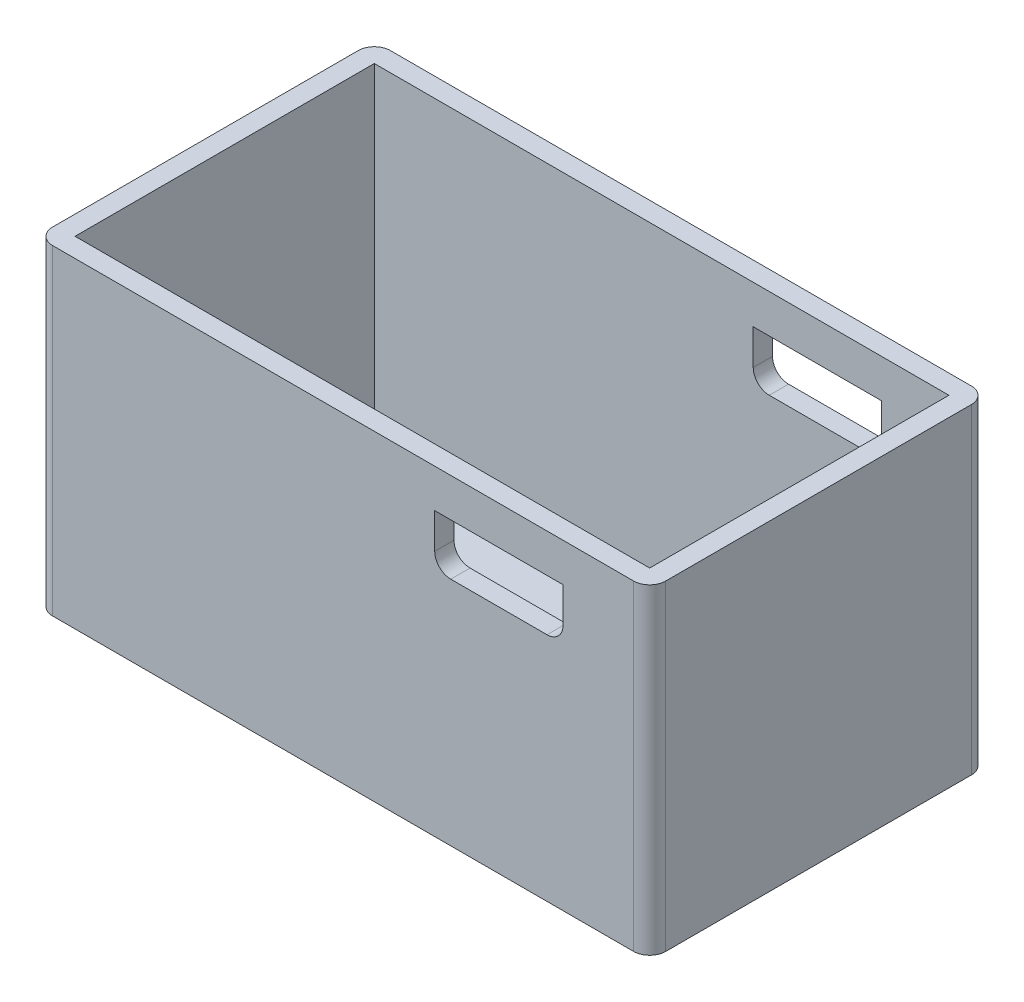
ISO-10303-21;
HEADER;
FILE_DESCRIPTION(('STEP AP214'),'2;1');
FILE_NAME('part.step','',(''),(''),'','','');
FILE_SCHEMA(('AUTOMOTIVE_DESIGN { 1 0 10303 214 1 1 1 1 }'));
ENDSEC;
DATA;
#1=APPLICATION_CONTEXT('core data for automotive mechanical design processes');
#2=APPLICATION_PROTOCOL_DEFINITION('international standard','automotive_design',2000,#1);
#3=PRODUCT_CONTEXT('',#1,'mechanical');
#4=PRODUCT('Part','Part','',(#3));
#5=PRODUCT_RELATED_PRODUCT_CATEGORY('part','',(#4));
#6=PRODUCT_DEFINITION_FORMATION('','',#4);
#7=PRODUCT_DEFINITION_CONTEXT('part definition',#1,'design');
#8=PRODUCT_DEFINITION('design','',#6,#7);
#9=PRODUCT_DEFINITION_SHAPE('','',#8);
#10=(LENGTH_UNIT() NAMED_UNIT(*) SI_UNIT(.MILLI.,.METRE.));
#11=(NAMED_UNIT(*) PLANE_ANGLE_UNIT() SI_UNIT($,.RADIAN.));
#12=(NAMED_UNIT(*) SI_UNIT($,.STERADIAN.) SOLID_ANGLE_UNIT());
#13=UNCERTAINTY_MEASURE_WITH_UNIT(LENGTH_MEASURE(1.E-05),#10,'distance_accuracy_value','');
#14=(GEOMETRIC_REPRESENTATION_CONTEXT(3) GLOBAL_UNCERTAINTY_ASSIGNED_CONTEXT((#13)) GLOBAL_UNIT_ASSIGNED_CONTEXT((#10,
#11,#12)) REPRESENTATION_CONTEXT('',''));
#15=CARTESIAN_POINT('',(0.,0.,0.));
#16=DIRECTION('',(0.,0.,1.));
#17=DIRECTION('',(1.,0.,0.));
#18=AXIS2_PLACEMENT_3D('',#15,#16,#17);
#19=CARTESIAN_POINT('',(12.1350024,12.7,-6.6850006));
#20=DIRECTION('',(-1.,0.,0.));
#21=DIRECTION('',(0.,0.,1.));
#22=AXIS2_PLACEMENT_3D('',#19,#20,#21);
#23=PLANE('',#22);
#24=DIRECTION('',(0.,0.,-1.));
#25=VECTOR('',#24,1.);
#26=CARTESIAN_POINT('',(12.1350024,0.,-6.6850006));
#27=LINE('',#26,#25);
#28=CARTESIAN_POINT('',(12.1350024,0.,6.0500006));
#29=VERTEX_POINT('',#28);
#30=CARTESIAN_POINT('',(12.1350024,0.,-6.0500006));
#31=VERTEX_POINT('',#30);
#32=EDGE_CURVE('E277',#29,#31,#27,.T.);
#33=ORIENTED_EDGE('',*,*,#32,.T.);
#34=DIRECTION('',(0.,-1.,0.));
#35=VECTOR('',#34,1.);
#36=CARTESIAN_POINT('',(12.1350024,12.7,-6.0500006));
#37=LINE('',#36,#35);
#38=CARTESIAN_POINT('',(12.1350024,12.7,-6.0500006));
#39=VERTEX_POINT('',#38);
#40=EDGE_CURVE('E391',#31,#39,#37,.F.);
#41=ORIENTED_EDGE('',*,*,#40,.T.);
#42=DIRECTION('',(0.,0.,-1.));
#43=VECTOR('',#42,1.);
#44=CARTESIAN_POINT('',(12.1350024,12.7,-6.6850006));
#45=LINE('',#44,#43);
#46=CARTESIAN_POINT('',(12.1350024,12.7,6.0500006));
#47=VERTEX_POINT('',#46);
#48=EDGE_CURVE('E311',#47,#39,#45,.T.);
#49=ORIENTED_EDGE('',*,*,#48,.F.);
#50=DIRECTION('',(0.,-1.,0.));
#51=VECTOR('',#50,1.);
#52=CARTESIAN_POINT('',(12.1350024,12.7,6.0500006));
#53=LINE('',#52,#51);
#54=EDGE_CURVE('E387',#47,#29,#53,.T.);
#55=ORIENTED_EDGE('',*,*,#54,.T.);
#56=EDGE_LOOP('',(#33,#41,#49,#55));
#57=FACE_BOUND('',#56,.T.);
#58=ADVANCED_FACE('F39',(#57),#23,.F.);
#59=CARTESIAN_POINT('',(-12.1350024,12.7,-6.6850006));
#60=DIRECTION('',(0.,0.,1.));
#61=DIRECTION('',(1.,0.,0.));
#62=AXIS2_PLACEMENT_3D('',#59,#60,#61);
#63=PLANE('',#62);
#64=DIRECTION('',(0.,-1.,0.));
#65=VECTOR('',#64,1.);
#66=CARTESIAN_POINT('',(3.6260024,11.176,-6.6850006));
#67=LINE('',#66,#65);
#68=CARTESIAN_POINT('',(3.6260024,11.176,-6.6850006));
#69=VERTEX_POINT('',#68);
#70=CARTESIAN_POINT('',(3.6260024,9.779,-6.6850006));
#71=VERTEX_POINT('',#70);
#72=EDGE_CURVE('E232',#69,#71,#67,.T.);
#73=ORIENTED_EDGE('',*,*,#72,.T.);
#74=CARTESIAN_POINT('',(4.2610024,9.779,-6.6850006));
#75=DIRECTION('',(0.,0.,1.));
#76=DIRECTION('',(1.,0.,0.));
#77=AXIS2_PLACEMENT_3D('',#74,#75,#76);
#78=CIRCLE('',#77,0.635);
#79=CARTESIAN_POINT('',(4.2610024,9.144,-6.6850006));
#80=VERTEX_POINT('',#79);
#81=EDGE_CURVE('E437',#71,#80,#78,.T.);
#82=ORIENTED_EDGE('',*,*,#81,.T.);
#83=DIRECTION('',(1.,0.,0.));
#84=VECTOR('',#83,1.);
#85=CARTESIAN_POINT('',(3.6260024,9.144,-6.6850006));
#86=LINE('',#85,#84);
#87=CARTESIAN_POINT('',(8.0710024,9.144,-6.6850006));
#88=VERTEX_POINT('',#87);
#89=EDGE_CURVE('E235',#80,#88,#86,.T.);
#90=ORIENTED_EDGE('',*,*,#89,.T.);
#91=CARTESIAN_POINT('',(8.0710024,9.779,-6.6850006));
#92=DIRECTION('',(0.,0.,1.));
#93=DIRECTION('',(1.,0.,0.));
#94=AXIS2_PLACEMENT_3D('',#91,#92,#93);
#95=CIRCLE('',#94,0.635);
#96=CARTESIAN_POINT('',(8.7060024,9.779,-6.6850006));
#97=VERTEX_POINT('',#96);
#98=EDGE_CURVE('E209',#88,#97,#95,.T.);
#99=ORIENTED_EDGE('',*,*,#98,.T.);
#100=DIRECTION('',(0.,1.,0.));
#101=VECTOR('',#100,1.);
#102=CARTESIAN_POINT('',(8.7060024,11.176,-6.6850006));
#103=LINE('',#102,#101);
#104=CARTESIAN_POINT('',(8.7060024,11.176,-6.6850006));
#105=VERTEX_POINT('',#104);
#106=EDGE_CURVE('E200',#97,#105,#103,.T.);
#107=ORIENTED_EDGE('',*,*,#106,.T.);
#108=DIRECTION('',(-1.,0.,0.));
#109=VECTOR('',#108,1.);
#110=CARTESIAN_POINT('',(3.6260024,11.176,-6.6850006));
#111=LINE('',#110,#109);
#112=EDGE_CURVE('E206',#105,#69,#111,.T.);
#113=ORIENTED_EDGE('',*,*,#112,.T.);
#114=EDGE_LOOP('',(#73,#82,#90,#99,#107,#113));
#115=FACE_BOUND('',#114,.T.);
#116=DIRECTION('',(-1.,0.,0.));
#117=VECTOR('',#116,1.);
#118=CARTESIAN_POINT('',(-12.1350024,0.,-6.6850006));
#119=LINE('',#118,#117);
#120=CARTESIAN_POINT('',(11.5000024,0.,-6.6850006));
#121=VERTEX_POINT('',#120);
#122=CARTESIAN_POINT('',(-11.5000024,0.,-6.6850006));
#123=VERTEX_POINT('',#122);
#124=EDGE_CURVE('E332',#121,#123,#119,.T.);
#125=ORIENTED_EDGE('',*,*,#124,.T.);
#126=DIRECTION('',(0.,-1.,0.));
#127=VECTOR('',#126,1.);
#128=CARTESIAN_POINT('',(-11.5000024,12.7,-6.6850006));
#129=LINE('',#128,#127);
#130=CARTESIAN_POINT('',(-11.5000024,12.7,-6.6850006));
#131=VERTEX_POINT('',#130);
#132=EDGE_CURVE('E365',#123,#131,#129,.F.);
#133=ORIENTED_EDGE('',*,*,#132,.T.);
#134=DIRECTION('',(-1.,0.,0.));
#135=VECTOR('',#134,1.);
#136=CARTESIAN_POINT('',(-12.1350024,12.7,-6.6850006));
#137=LINE('',#136,#135);
#138=CARTESIAN_POINT('',(11.5000024,12.7,-6.6850006));
#139=VERTEX_POINT('',#138);
#140=EDGE_CURVE('E315',#139,#131,#137,.T.);
#141=ORIENTED_EDGE('',*,*,#140,.F.);
#142=DIRECTION('',(0.,-1.,0.));
#143=VECTOR('',#142,1.);
#144=CARTESIAN_POINT('',(11.5000024,12.7,-6.6850006));
#145=LINE('',#144,#143);
#146=EDGE_CURVE('E361',#139,#121,#145,.T.);
#147=ORIENTED_EDGE('',*,*,#146,.T.);
#148=EDGE_LOOP('',(#125,#133,#141,#147));
#149=FACE_BOUND('',#148,.T.);
#150=ADVANCED_FACE('F203',(#115,#149),#63,.F.);
#151=CARTESIAN_POINT('',(-12.1350024,12.7,-6.6850006));
#152=DIRECTION('',(1.,0.,0.));
#153=DIRECTION('',(0.,0.,-1.));
#154=AXIS2_PLACEMENT_3D('',#151,#152,#153);
#155=PLANE('',#154);
#156=DIRECTION('',(0.,0.,1.));
#157=VECTOR('',#156,1.);
#158=CARTESIAN_POINT('',(-12.1350024,12.7,-6.6850006));
#159=LINE('',#158,#157);
#160=CARTESIAN_POINT('',(-12.1350024,12.7,-6.0500006));
#161=VERTEX_POINT('',#160);
#162=CARTESIAN_POINT('',(-12.1350024,12.7,6.0500006));
#163=VERTEX_POINT('',#162);
#164=EDGE_CURVE('E320',#161,#163,#159,.T.);
#165=ORIENTED_EDGE('',*,*,#164,.F.);
#166=DIRECTION('',(0.,-1.,0.));
#167=VECTOR('',#166,1.);
#168=CARTESIAN_POINT('',(-12.1350024,12.7,-6.0500006));
#169=LINE('',#168,#167);
#170=CARTESIAN_POINT('',(-12.1350024,0.,-6.0500006));
#171=VERTEX_POINT('',#170);
#172=EDGE_CURVE('E345',#161,#171,#169,.T.);
#173=ORIENTED_EDGE('',*,*,#172,.T.);
#174=DIRECTION('',(0.,0.,1.));
#175=VECTOR('',#174,1.);
#176=CARTESIAN_POINT('',(-12.1350024,0.,-6.6850006));
#177=LINE('',#176,#175);
#178=CARTESIAN_POINT('',(-12.1350024,0.,6.0500006));
#179=VERTEX_POINT('',#178);
#180=EDGE_CURVE('E336',#171,#179,#177,.T.);
#181=ORIENTED_EDGE('',*,*,#180,.T.);
#182=DIRECTION('',(0.,-1.,0.));
#183=VECTOR('',#182,1.);
#184=CARTESIAN_POINT('',(-12.1350024,12.7,6.0500006));
#185=LINE('',#184,#183);
#186=EDGE_CURVE('E328',#179,#163,#185,.F.);
#187=ORIENTED_EDGE('',*,*,#186,.T.);
#188=EDGE_LOOP('',(#165,#173,#181,#187));
#189=FACE_BOUND('',#188,.T.);
#190=ADVANCED_FACE('F497',(#189),#155,.F.);
#191=CARTESIAN_POINT('',(-12.1350024,12.7,6.6850006));
#192=DIRECTION('',(0.,0.,-1.));
#193=DIRECTION('',(-1.,0.,0.));
#194=AXIS2_PLACEMENT_3D('',#191,#192,#193);
#195=PLANE('',#194);
#196=DIRECTION('',(-1.,0.,0.));
#197=VECTOR('',#196,1.);
#198=CARTESIAN_POINT('',(3.6260024,11.176,6.6850006));
#199=LINE('',#198,#197);
#200=CARTESIAN_POINT('',(8.7060024,11.176,6.6850006));
#201=VERTEX_POINT('',#200);
#202=CARTESIAN_POINT('',(3.6260024,11.176,6.6850006));
#203=VERTEX_POINT('',#202);
#204=EDGE_CURVE('E243',#201,#203,#199,.T.);
#205=ORIENTED_EDGE('',*,*,#204,.F.);
#206=DIRECTION('',(0.,1.,0.));
#207=VECTOR('',#206,1.);
#208=CARTESIAN_POINT('',(8.7060024,11.176,6.6850006));
#209=LINE('',#208,#207);
#210=CARTESIAN_POINT('',(8.7060024,9.779,6.6850006));
#211=VERTEX_POINT('',#210);
#212=EDGE_CURVE('E240',#211,#201,#209,.T.);
#213=ORIENTED_EDGE('',*,*,#212,.F.);
#214=CARTESIAN_POINT('',(8.0710024,9.779,6.6850006));
#215=DIRECTION('',(0.,0.,-1.));
#216=DIRECTION('',(-1.,0.,0.));
#217=AXIS2_PLACEMENT_3D('',#214,#215,#216);
#218=CIRCLE('',#217,0.635);
#219=CARTESIAN_POINT('',(8.0710024,9.144,6.6850006));
#220=VERTEX_POINT('',#219);
#221=EDGE_CURVE('E445',#211,#220,#218,.T.);
#222=ORIENTED_EDGE('',*,*,#221,.T.);
#223=DIRECTION('',(1.,0.,0.));
#224=VECTOR('',#223,1.);
#225=CARTESIAN_POINT('',(3.6260024,9.144,6.6850006));
#226=LINE('',#225,#224);
#227=CARTESIAN_POINT('',(4.2610024,9.144,6.6850006));
#228=VERTEX_POINT('',#227);
#229=EDGE_CURVE('E214',#228,#220,#226,.T.);
#230=ORIENTED_EDGE('',*,*,#229,.F.);
#231=CARTESIAN_POINT('',(4.2610024,9.779,6.6850006));
#232=DIRECTION('',(0.,0.,-1.));
#233=DIRECTION('',(-1.,0.,0.));
#234=AXIS2_PLACEMENT_3D('',#231,#232,#233);
#235=CIRCLE('',#234,0.635);
#236=CARTESIAN_POINT('',(3.6260024,9.779,6.6850006));
#237=VERTEX_POINT('',#236);
#238=EDGE_CURVE('E48',#228,#237,#235,.T.);
#239=ORIENTED_EDGE('',*,*,#238,.T.);
#240=DIRECTION('',(0.,-1.,0.));
#241=VECTOR('',#240,1.);
#242=CARTESIAN_POINT('',(3.6260024,11.176,6.6850006));
#243=LINE('',#242,#241);
#244=EDGE_CURVE('E247',#203,#237,#243,.T.);
#245=ORIENTED_EDGE('',*,*,#244,.F.);
#246=EDGE_LOOP('',(#205,#213,#222,#230,#239,#245));
#247=FACE_BOUND('',#246,.T.);
#248=DIRECTION('',(1.,0.,0.));
#249=VECTOR('',#248,1.);
#250=CARTESIAN_POINT('',(-12.1350024,12.7,6.6850006));
#251=LINE('',#250,#249);
#252=CARTESIAN_POINT('',(-11.5000024,12.7,6.6850006));
#253=VERTEX_POINT('',#252);
#254=CARTESIAN_POINT('',(11.5000024,12.7,6.6850006));
#255=VERTEX_POINT('',#254);
#256=EDGE_CURVE('E324',#253,#255,#251,.T.);
#257=ORIENTED_EDGE('',*,*,#256,.F.);
#258=DIRECTION('',(0.,-1.,0.));
#259=VECTOR('',#258,1.);
#260=CARTESIAN_POINT('',(-11.5000024,12.7,6.6850006));
#261=LINE('',#260,#259);
#262=CARTESIAN_POINT('',(-11.5000024,0.,6.6850006));
#263=VERTEX_POINT('',#262);
#264=EDGE_CURVE('E383',#253,#263,#261,.T.);
#265=ORIENTED_EDGE('',*,*,#264,.T.);
#266=DIRECTION('',(1.,0.,0.));
#267=VECTOR('',#266,1.);
#268=CARTESIAN_POINT('',(-12.1350024,0.,6.6850006));
#269=LINE('',#268,#267);
#270=CARTESIAN_POINT('',(11.5000024,0.,6.6850006));
#271=VERTEX_POINT('',#270);
#272=EDGE_CURVE('E316',#263,#271,#269,.T.);
#273=ORIENTED_EDGE('',*,*,#272,.T.);
#274=DIRECTION('',(0.,-1.,0.));
#275=VECTOR('',#274,1.);
#276=CARTESIAN_POINT('',(11.5000024,12.7,6.6850006));
#277=LINE('',#276,#275);
#278=EDGE_CURVE('E380',#271,#255,#277,.F.);
#279=ORIENTED_EDGE('',*,*,#278,.T.);
#280=EDGE_LOOP('',(#257,#265,#273,#279));
#281=FACE_BOUND('',#280,.T.);
#282=ADVANCED_FACE('F463',(#247,#281),#195,.F.);
#283=CARTESIAN_POINT('',(0.,12.7,0.));
#284=DIRECTION('',(0.,1.,0.));
#285=DIRECTION('',(0.,0.,1.));
#286=AXIS2_PLACEMENT_3D('',#283,#284,#285);
#287=PLANE('',#286);
#288=DIRECTION('',(0.,0.,-1.));
#289=VECTOR('',#288,1.);
#290=CARTESIAN_POINT('',(11.3730024,12.7,-6.6850006));
#291=LINE('',#290,#289);
#292=CARTESIAN_POINT('',(11.3730024,12.7,5.9230006));
#293=VERTEX_POINT('',#292);
#294=CARTESIAN_POINT('',(11.3730024,12.7,-5.9230006));
#295=VERTEX_POINT('',#294);
#296=EDGE_CURVE('E299',#293,#295,#291,.T.);
#297=ORIENTED_EDGE('',*,*,#296,.F.);
#298=DIRECTION('',(1.,0.,0.));
#299=VECTOR('',#298,1.);
#300=CARTESIAN_POINT('',(-12.1350024,12.7,5.9230006));
#301=LINE('',#300,#299);
#302=CARTESIAN_POINT('',(-11.3730024,12.7,5.9230006));
#303=VERTEX_POINT('',#302);
#304=EDGE_CURVE('E284',#303,#293,#301,.T.);
#305=ORIENTED_EDGE('',*,*,#304,.F.);
#306=DIRECTION('',(0.,0.,1.));
#307=VECTOR('',#306,1.);
#308=CARTESIAN_POINT('',(-11.3730024,12.7,-6.6850006));
#309=LINE('',#308,#307);
#310=CARTESIAN_POINT('',(-11.3730024,12.7,-5.9230006));
#311=VERTEX_POINT('',#310);
#312=EDGE_CURVE('E305',#311,#303,#309,.T.);
#313=ORIENTED_EDGE('',*,*,#312,.F.);
#314=DIRECTION('',(-1.,0.,0.));
#315=VECTOR('',#314,1.);
#316=CARTESIAN_POINT('',(-12.1350024,12.7,-5.9230006));
#317=LINE('',#316,#315);
#318=EDGE_CURVE('E302',#295,#311,#317,.T.);
#319=ORIENTED_EDGE('',*,*,#318,.F.);
#320=EDGE_LOOP('',(#297,#305,#313,#319));
#321=FACE_BOUND('',#320,.T.);
#322=ORIENTED_EDGE('',*,*,#140,.T.);
#323=CARTESIAN_POINT('',(-11.5000024,12.7,-6.0500006));
#324=DIRECTION('',(0.,1.,0.));
#325=DIRECTION('',(0.,0.,1.));
#326=AXIS2_PLACEMENT_3D('',#323,#324,#325);
#327=CIRCLE('',#326,0.635);
#328=EDGE_CURVE('E377',#131,#161,#327,.T.);
#329=ORIENTED_EDGE('',*,*,#328,.T.);
#330=ORIENTED_EDGE('',*,*,#164,.T.);
#331=CARTESIAN_POINT('',(-11.5000024,12.7,6.0500006));
#332=DIRECTION('',(0.,1.,0.));
#333=DIRECTION('',(0.,0.,1.));
#334=AXIS2_PLACEMENT_3D('',#331,#332,#333);
#335=CIRCLE('',#334,0.635);
#336=EDGE_CURVE('E374',#163,#253,#335,.T.);
#337=ORIENTED_EDGE('',*,*,#336,.T.);
#338=ORIENTED_EDGE('',*,*,#256,.T.);
#339=CARTESIAN_POINT('',(11.5000024,12.7,6.0500006));
#340=DIRECTION('',(0.,1.,0.));
#341=DIRECTION('',(0.,0.,1.));
#342=AXIS2_PLACEMENT_3D('',#339,#340,#341);
#343=CIRCLE('',#342,0.635);
#344=EDGE_CURVE('E368',#255,#47,#343,.T.);
#345=ORIENTED_EDGE('',*,*,#344,.T.);
#346=ORIENTED_EDGE('',*,*,#48,.T.);
#347=CARTESIAN_POINT('',(11.5000024,12.7,-6.0500006));
#348=DIRECTION('',(0.,1.,0.));
#349=DIRECTION('',(0.,0.,1.));
#350=AXIS2_PLACEMENT_3D('',#347,#348,#349);
#351=CIRCLE('',#350,0.635);
#352=EDGE_CURVE('E371',#39,#139,#351,.T.);
#353=ORIENTED_EDGE('',*,*,#352,.T.);
#354=EDGE_LOOP('',(#322,#329,#330,#337,#338,#345,#346,#353));
#355=FACE_BOUND('',#354,.T.);
#356=ADVANCED_FACE('F627',(#321,#355),#287,.T.);
#357=CARTESIAN_POINT('',(0.,0.,0.));
#358=DIRECTION('',(0.,1.,0.));
#359=DIRECTION('',(0.,0.,1.));
#360=AXIS2_PLACEMENT_3D('',#357,#358,#359);
#361=PLANE('',#360);
#362=ORIENTED_EDGE('',*,*,#180,.F.);
#363=CARTESIAN_POINT('',(-11.5000024,0.,-6.0500006));
#364=DIRECTION('',(0.,1.,0.));
#365=DIRECTION('',(0.,0.,1.));
#366=AXIS2_PLACEMENT_3D('',#363,#364,#365);
#367=CIRCLE('',#366,0.635);
#368=EDGE_CURVE('E358',#171,#123,#367,.F.);
#369=ORIENTED_EDGE('',*,*,#368,.T.);
#370=ORIENTED_EDGE('',*,*,#124,.F.);
#371=CARTESIAN_POINT('',(11.5000024,0.,-6.0500006));
#372=DIRECTION('',(0.,1.,0.));
#373=DIRECTION('',(0.,0.,1.));
#374=AXIS2_PLACEMENT_3D('',#371,#372,#373);
#375=CIRCLE('',#374,0.635);
#376=EDGE_CURVE('E352',#121,#31,#375,.F.);
#377=ORIENTED_EDGE('',*,*,#376,.T.);
#378=ORIENTED_EDGE('',*,*,#32,.F.);
#379=CARTESIAN_POINT('',(11.5000024,0.,6.0500006));
#380=DIRECTION('',(0.,1.,0.));
#381=DIRECTION('',(0.,0.,1.));
#382=AXIS2_PLACEMENT_3D('',#379,#380,#381);
#383=CIRCLE('',#382,0.635);
#384=EDGE_CURVE('E349',#29,#271,#383,.F.);
#385=ORIENTED_EDGE('',*,*,#384,.T.);
#386=ORIENTED_EDGE('',*,*,#272,.F.);
#387=CARTESIAN_POINT('',(-11.5000024,0.,6.0500006));
#388=DIRECTION('',(0.,1.,0.));
#389=DIRECTION('',(0.,0.,1.));
#390=AXIS2_PLACEMENT_3D('',#387,#388,#389);
#391=CIRCLE('',#390,0.635);
#392=EDGE_CURVE('E355',#263,#179,#391,.F.);
#393=ORIENTED_EDGE('',*,*,#392,.T.);
#394=EDGE_LOOP('',(#362,#369,#370,#377,#378,#385,#386,#393));
#395=FACE_BOUND('',#394,.T.);
#396=ADVANCED_FACE('F677',(#395),#361,.F.);
#397=CARTESIAN_POINT('',(11.3730024,12.7,-6.6850006));
#398=DIRECTION('',(-1.,0.,0.));
#399=DIRECTION('',(0.,0.,1.));
#400=AXIS2_PLACEMENT_3D('',#397,#398,#399);
#401=PLANE('',#400);
#402=DIRECTION('',(0.,0.,-1.));
#403=VECTOR('',#402,1.);
#404=CARTESIAN_POINT('',(11.3730024,0.762000000000001,-6.6850006));
#405=LINE('',#404,#403);
#406=CARTESIAN_POINT('',(11.3730024,0.762,5.9230006));
#407=VERTEX_POINT('',#406);
#408=CARTESIAN_POINT('',(11.3730024,0.762,-5.9230006));
#409=VERTEX_POINT('',#408);
#410=EDGE_CURVE('E268',#407,#409,#405,.T.);
#411=ORIENTED_EDGE('',*,*,#410,.F.);
#412=DIRECTION('',(0.,-1.,0.));
#413=VECTOR('',#412,1.);
#414=CARTESIAN_POINT('',(11.3730024,12.7,5.9230006));
#415=LINE('',#414,#413);
#416=EDGE_CURVE('E279',#293,#407,#415,.T.);
#417=ORIENTED_EDGE('',*,*,#416,.F.);
#418=ORIENTED_EDGE('',*,*,#296,.T.);
#419=DIRECTION('',(0.,-1.,0.));
#420=VECTOR('',#419,1.);
#421=CARTESIAN_POINT('',(11.3730024,12.7,-5.9230006));
#422=LINE('',#421,#420);
#423=EDGE_CURVE('E273',#295,#409,#422,.T.);
#424=ORIENTED_EDGE('',*,*,#423,.T.);
#425=EDGE_LOOP('',(#411,#417,#418,#424));
#426=FACE_BOUND('',#425,.T.);
#427=ADVANCED_FACE('F615',(#426),#401,.T.);
#428=CARTESIAN_POINT('',(-12.1350024,12.7,-5.9230006));
#429=DIRECTION('',(0.,0.,1.));
#430=DIRECTION('',(1.,0.,0.));
#431=AXIS2_PLACEMENT_3D('',#428,#429,#430);
#432=PLANE('',#431);
#433=DIRECTION('',(0.,1.,0.));
#434=VECTOR('',#433,1.);
#435=CARTESIAN_POINT('',(8.7060024,12.7,-5.9230006));
#436=LINE('',#435,#434);
#437=CARTESIAN_POINT('',(8.7060024,9.779,-5.9230006));
#438=VERTEX_POINT('',#437);
#439=CARTESIAN_POINT('',(8.7060024,11.176,-5.9230006));
#440=VERTEX_POINT('',#439);
#441=EDGE_CURVE('E220',#438,#440,#436,.T.);
#442=ORIENTED_EDGE('',*,*,#441,.F.);
#443=CARTESIAN_POINT('',(8.0710024,9.779,-5.9230006));
#444=DIRECTION('',(0.,0.,1.));
#445=DIRECTION('',(1.,0.,0.));
#446=AXIS2_PLACEMENT_3D('',#443,#444,#445);
#447=CIRCLE('',#446,0.635);
#448=CARTESIAN_POINT('',(8.0710024,9.144,-5.9230006));
#449=VERTEX_POINT('',#448);
#450=EDGE_CURVE('E440',#438,#449,#447,.F.);
#451=ORIENTED_EDGE('',*,*,#450,.T.);
#452=DIRECTION('',(1.,0.,0.));
#453=VECTOR('',#452,1.);
#454=CARTESIAN_POINT('',(-12.1350024,9.14399999999999,-5.9230006));
#455=LINE('',#454,#453);
#456=CARTESIAN_POINT('',(4.2610024,9.144,-5.9230006));
#457=VERTEX_POINT('',#456);
#458=EDGE_CURVE('E262',#457,#449,#455,.T.);
#459=ORIENTED_EDGE('',*,*,#458,.F.);
#460=CARTESIAN_POINT('',(4.2610024,9.779,-5.9230006));
#461=DIRECTION('',(0.,0.,1.));
#462=DIRECTION('',(1.,0.,0.));
#463=AXIS2_PLACEMENT_3D('',#460,#461,#462);
#464=CIRCLE('',#463,0.635);
#465=CARTESIAN_POINT('',(3.6260024,9.779,-5.9230006));
#466=VERTEX_POINT('',#465);
#467=EDGE_CURVE('E434',#457,#466,#464,.F.);
#468=ORIENTED_EDGE('',*,*,#467,.T.);
#469=DIRECTION('',(0.,-1.,0.));
#470=VECTOR('',#469,1.);
#471=CARTESIAN_POINT('',(3.6260024,12.7,-5.9230006));
#472=LINE('',#471,#470);
#473=CARTESIAN_POINT('',(3.6260024,11.176,-5.9230006));
#474=VERTEX_POINT('',#473);
#475=EDGE_CURVE('E258',#474,#466,#472,.T.);
#476=ORIENTED_EDGE('',*,*,#475,.F.);
#477=DIRECTION('',(-1.,0.,0.));
#478=VECTOR('',#477,1.);
#479=CARTESIAN_POINT('',(-12.1350024,11.176,-5.9230006));
#480=LINE('',#479,#478);
#481=EDGE_CURVE('E254',#440,#474,#480,.T.);
#482=ORIENTED_EDGE('',*,*,#481,.F.);
#483=EDGE_LOOP('',(#442,#451,#459,#468,#476,#482));
#484=FACE_BOUND('',#483,.T.);
#485=DIRECTION('',(-1.,0.,0.));
#486=VECTOR('',#485,1.);
#487=CARTESIAN_POINT('',(-12.1350024,0.762000000000001,-5.9230006));
#488=LINE('',#487,#486);
#489=CARTESIAN_POINT('',(-11.3730024,0.762,-5.9230006));
#490=VERTEX_POINT('',#489);
#491=EDGE_CURVE('E272',#409,#490,#488,.T.);
#492=ORIENTED_EDGE('',*,*,#491,.F.);
#493=ORIENTED_EDGE('',*,*,#423,.F.);
#494=ORIENTED_EDGE('',*,*,#318,.T.);
#495=DIRECTION('',(0.,-1.,0.));
#496=VECTOR('',#495,1.);
#497=CARTESIAN_POINT('',(-11.3730024,12.7,-5.9230006));
#498=LINE('',#497,#496);
#499=EDGE_CURVE('E278',#311,#490,#498,.T.);
#500=ORIENTED_EDGE('',*,*,#499,.T.);
#501=EDGE_LOOP('',(#492,#493,#494,#500));
#502=FACE_BOUND('',#501,.T.);
#503=ADVANCED_FACE('F610',(#484,#502),#432,.T.);
#504=CARTESIAN_POINT('',(-11.3730024,12.7,-6.6850006));
#505=DIRECTION('',(1.,0.,0.));
#506=DIRECTION('',(0.,0.,-1.));
#507=AXIS2_PLACEMENT_3D('',#504,#505,#506);
#508=PLANE('',#507);
#509=DIRECTION('',(0.,0.,1.));
#510=VECTOR('',#509,1.);
#511=CARTESIAN_POINT('',(-11.3730024,0.762000000000001,-6.6850006));
#512=LINE('',#511,#510);
#513=CARTESIAN_POINT('',(-11.3730024,0.762,5.9230006));
#514=VERTEX_POINT('',#513);
#515=EDGE_CURVE('E287',#490,#514,#512,.T.);
#516=ORIENTED_EDGE('',*,*,#515,.F.);
#517=ORIENTED_EDGE('',*,*,#499,.F.);
#518=ORIENTED_EDGE('',*,*,#312,.T.);
#519=DIRECTION('',(0.,-1.,0.));
#520=VECTOR('',#519,1.);
#521=CARTESIAN_POINT('',(-11.3730024,12.7,5.9230006));
#522=LINE('',#521,#520);
#523=EDGE_CURVE('E283',#303,#514,#522,.T.);
#524=ORIENTED_EDGE('',*,*,#523,.T.);
#525=EDGE_LOOP('',(#516,#517,#518,#524));
#526=FACE_BOUND('',#525,.T.);
#527=ADVANCED_FACE('F601',(#526),#508,.T.);
#528=CARTESIAN_POINT('',(-12.1350024,12.7,5.9230006));
#529=DIRECTION('',(0.,0.,-1.));
#530=DIRECTION('',(-1.,0.,0.));
#531=AXIS2_PLACEMENT_3D('',#528,#529,#530);
#532=PLANE('',#531);
#533=DIRECTION('',(0.,-1.,0.));
#534=VECTOR('',#533,1.);
#535=CARTESIAN_POINT('',(8.7060024,12.7,5.9230006));
#536=LINE('',#535,#534);
#537=CARTESIAN_POINT('',(8.7060024,11.176,5.9230006));
#538=VERTEX_POINT('',#537);
#539=CARTESIAN_POINT('',(8.7060024,9.779,5.9230006));
#540=VERTEX_POINT('',#539);
#541=EDGE_CURVE('E404',#538,#540,#536,.T.);
#542=ORIENTED_EDGE('',*,*,#541,.F.);
#543=DIRECTION('',(1.,0.,0.));
#544=VECTOR('',#543,1.);
#545=CARTESIAN_POINT('',(-12.1350024,11.176,5.9230006));
#546=LINE('',#545,#544);
#547=CARTESIAN_POINT('',(3.6260024,11.176,5.9230006));
#548=VERTEX_POINT('',#547);
#549=EDGE_CURVE('E394',#548,#538,#546,.T.);
#550=ORIENTED_EDGE('',*,*,#549,.F.);
#551=DIRECTION('',(0.,1.,0.));
#552=VECTOR('',#551,1.);
#553=CARTESIAN_POINT('',(3.6260024,12.7,5.9230006));
#554=LINE('',#553,#552);
#555=CARTESIAN_POINT('',(3.6260024,9.779,5.9230006));
#556=VERTEX_POINT('',#555);
#557=EDGE_CURVE('E397',#556,#548,#554,.T.);
#558=ORIENTED_EDGE('',*,*,#557,.F.);
#559=CARTESIAN_POINT('',(4.2610024,9.779,5.9230006));
#560=DIRECTION('',(0.,0.,-1.));
#561=DIRECTION('',(-1.,0.,0.));
#562=AXIS2_PLACEMENT_3D('',#559,#560,#561);
#563=CIRCLE('',#562,0.635);
#564=CARTESIAN_POINT('',(4.2610024,9.144,5.9230006));
#565=VERTEX_POINT('',#564);
#566=EDGE_CURVE('E11',#556,#565,#563,.F.);
#567=ORIENTED_EDGE('',*,*,#566,.T.);
#568=DIRECTION('',(-1.,0.,0.));
#569=VECTOR('',#568,1.);
#570=CARTESIAN_POINT('',(-12.1350024,9.14399999999999,5.9230006));
#571=LINE('',#570,#569);
#572=CARTESIAN_POINT('',(8.0710024,9.144,5.9230006));
#573=VERTEX_POINT('',#572);
#574=EDGE_CURVE('E400',#573,#565,#571,.T.);
#575=ORIENTED_EDGE('',*,*,#574,.F.);
#576=CARTESIAN_POINT('',(8.0710024,9.779,5.9230006));
#577=DIRECTION('',(0.,0.,-1.));
#578=DIRECTION('',(-1.,0.,0.));
#579=AXIS2_PLACEMENT_3D('',#576,#577,#578);
#580=CIRCLE('',#579,0.635);
#581=EDGE_CURVE('E448',#573,#540,#580,.F.);
#582=ORIENTED_EDGE('',*,*,#581,.T.);
#583=EDGE_LOOP('',(#542,#550,#558,#567,#575,#582));
#584=FACE_BOUND('',#583,.T.);
#585=DIRECTION('',(1.,0.,0.));
#586=VECTOR('',#585,1.);
#587=CARTESIAN_POINT('',(-12.1350024,0.762000000000001,5.9230006));
#588=LINE('',#587,#586);
#589=EDGE_CURVE('E293',#514,#407,#588,.T.);
#590=ORIENTED_EDGE('',*,*,#589,.F.);
#591=ORIENTED_EDGE('',*,*,#523,.F.);
#592=ORIENTED_EDGE('',*,*,#304,.T.);
#593=ORIENTED_EDGE('',*,*,#416,.T.);
#594=EDGE_LOOP('',(#590,#591,#592,#593));
#595=FACE_BOUND('',#594,.T.);
#596=ADVANCED_FACE('F471',(#584,#595),#532,.T.);
#597=CARTESIAN_POINT('',(0.,0.762,0.));
#598=DIRECTION('',(0.,1.,0.));
#599=DIRECTION('',(0.,0.,1.));
#600=AXIS2_PLACEMENT_3D('',#597,#598,#599);
#601=PLANE('',#600);
#602=ORIENTED_EDGE('',*,*,#410,.T.);
#603=ORIENTED_EDGE('',*,*,#491,.T.);
#604=ORIENTED_EDGE('',*,*,#515,.T.);
#605=ORIENTED_EDGE('',*,*,#589,.T.);
#606=EDGE_LOOP('',(#602,#603,#604,#605));
#607=FACE_BOUND('',#606,.T.);
#608=ADVANCED_FACE('F505',(#607),#601,.T.);
#609=CARTESIAN_POINT('',(-11.5000024,12.7,-6.0500006));
#610=DIRECTION('',(0.,-1.,0.));
#611=DIRECTION('',(0.,0.,-1.));
#612=AXIS2_PLACEMENT_3D('',#609,#610,#611);
#613=CYLINDRICAL_SURFACE('',#612,0.635);
#614=ORIENTED_EDGE('',*,*,#328,.F.);
#615=ORIENTED_EDGE('',*,*,#132,.F.);
#616=ORIENTED_EDGE('',*,*,#368,.F.);
#617=ORIENTED_EDGE('',*,*,#172,.F.);
#618=EDGE_LOOP('',(#614,#615,#616,#617));
#619=FACE_BOUND('',#618,.T.);
#620=ADVANCED_FACE('F501',(#619),#613,.T.);
#621=CARTESIAN_POINT('',(-11.5000024,12.7,6.0500006));
#622=DIRECTION('',(0.,-1.,0.));
#623=DIRECTION('',(0.,0.,-1.));
#624=AXIS2_PLACEMENT_3D('',#621,#622,#623);
#625=CYLINDRICAL_SURFACE('',#624,0.635);
#626=ORIENTED_EDGE('',*,*,#336,.F.);
#627=ORIENTED_EDGE('',*,*,#186,.F.);
#628=ORIENTED_EDGE('',*,*,#392,.F.);
#629=ORIENTED_EDGE('',*,*,#264,.F.);
#630=EDGE_LOOP('',(#626,#627,#628,#629));
#631=FACE_BOUND('',#630,.T.);
#632=ADVANCED_FACE('F504',(#631),#625,.T.);
#633=CARTESIAN_POINT('',(11.5000024,12.7,-6.0500006));
#634=DIRECTION('',(0.,-1.,0.));
#635=DIRECTION('',(0.,0.,-1.));
#636=AXIS2_PLACEMENT_3D('',#633,#634,#635);
#637=CYLINDRICAL_SURFACE('',#636,0.635);
#638=ORIENTED_EDGE('',*,*,#352,.F.);
#639=ORIENTED_EDGE('',*,*,#40,.F.);
#640=ORIENTED_EDGE('',*,*,#376,.F.);
#641=ORIENTED_EDGE('',*,*,#146,.F.);
#642=EDGE_LOOP('',(#638,#639,#640,#641));
#643=FACE_BOUND('',#642,.T.);
#644=ADVANCED_FACE('F509',(#643),#637,.T.);
#645=CARTESIAN_POINT('',(11.5000024,12.7,6.0500006));
#646=DIRECTION('',(0.,-1.,0.));
#647=DIRECTION('',(0.,0.,-1.));
#648=AXIS2_PLACEMENT_3D('',#645,#646,#647);
#649=CYLINDRICAL_SURFACE('',#648,0.635);
#650=ORIENTED_EDGE('',*,*,#344,.F.);
#651=ORIENTED_EDGE('',*,*,#278,.F.);
#652=ORIENTED_EDGE('',*,*,#384,.F.);
#653=ORIENTED_EDGE('',*,*,#54,.F.);
#654=EDGE_LOOP('',(#650,#651,#652,#653));
#655=FACE_BOUND('',#654,.T.);
#656=ADVANCED_FACE('F513',(#655),#649,.T.);
#657=CARTESIAN_POINT('',(3.6260024,11.176,-6.6850006));
#658=DIRECTION('',(0.,1.,0.));
#659=DIRECTION('',(0.,0.,1.));
#660=AXIS2_PLACEMENT_3D('',#657,#658,#659);
#661=PLANE('',#660);
#662=ORIENTED_EDGE('',*,*,#549,.T.);
#663=DIRECTION('',(0.,0.,1.));
#664=VECTOR('',#663,1.);
#665=CARTESIAN_POINT('',(8.7060024,11.176,-6.6850006));
#666=LINE('',#665,#664);
#667=EDGE_CURVE('E225',#538,#201,#666,.T.);
#668=ORIENTED_EDGE('',*,*,#667,.T.);
#669=ORIENTED_EDGE('',*,*,#204,.T.);
#670=DIRECTION('',(0.,0.,1.));
#671=VECTOR('',#670,1.);
#672=CARTESIAN_POINT('',(3.6260024,11.176,-6.6850006));
#673=LINE('',#672,#671);
#674=EDGE_CURVE('E224',#548,#203,#673,.T.);
#675=ORIENTED_EDGE('',*,*,#674,.F.);
#676=EDGE_LOOP('',(#662,#668,#669,#675));
#677=FACE_BOUND('',#676,.T.);
#678=ADVANCED_FACE('F457',(#677),#661,.F.);
#679=CARTESIAN_POINT('',(3.6260024,11.176,-6.6850006));
#680=DIRECTION('',(-1.,0.,0.));
#681=DIRECTION('',(0.,-1.,0.));
#682=AXIS2_PLACEMENT_3D('',#679,#680,#681);
#683=PLANE('',#682);
#684=ORIENTED_EDGE('',*,*,#244,.T.);
#685=DIRECTION('',(0.,0.,1.));
#686=VECTOR('',#685,1.);
#687=CARTESIAN_POINT('',(3.6260024,9.779,5.9230006));
#688=LINE('',#687,#686);
#689=EDGE_CURVE('E61',#237,#556,#688,.F.);
#690=ORIENTED_EDGE('',*,*,#689,.T.);
#691=ORIENTED_EDGE('',*,*,#557,.T.);
#692=ORIENTED_EDGE('',*,*,#674,.T.);
#693=EDGE_LOOP('',(#684,#690,#691,#692));
#694=FACE_BOUND('',#693,.T.);
#695=ADVANCED_FACE('F465',(#694),#683,.F.);
#696=CARTESIAN_POINT('',(3.6260024,9.144,-6.6850006));
#697=DIRECTION('',(0.,-1.,0.));
#698=DIRECTION('',(1.,0.,0.));
#699=AXIS2_PLACEMENT_3D('',#696,#697,#698);
#700=PLANE('',#699);
#701=ORIENTED_EDGE('',*,*,#229,.T.);
#702=DIRECTION('',(0.,0.,1.));
#703=VECTOR('',#702,1.);
#704=CARTESIAN_POINT('',(8.0710024,9.144,5.9230006));
#705=LINE('',#704,#703);
#706=EDGE_CURVE('E429',#220,#573,#705,.F.);
#707=ORIENTED_EDGE('',*,*,#706,.T.);
#708=ORIENTED_EDGE('',*,*,#574,.T.);
#709=DIRECTION('',(0.,0.,1.));
#710=VECTOR('',#709,1.);
#711=CARTESIAN_POINT('',(4.2610024,9.144,6.6850006));
#712=LINE('',#711,#710);
#713=EDGE_CURVE('E425',#565,#228,#712,.T.);
#714=ORIENTED_EDGE('',*,*,#713,.T.);
#715=EDGE_LOOP('',(#701,#707,#708,#714));
#716=FACE_BOUND('',#715,.T.);
#717=ADVANCED_FACE('F475',(#716),#700,.F.);
#718=CARTESIAN_POINT('',(8.7060024,11.176,-6.6850006));
#719=DIRECTION('',(1.,0.,0.));
#720=DIRECTION('',(0.,1.,0.));
#721=AXIS2_PLACEMENT_3D('',#718,#719,#720);
#722=PLANE('',#721);
#723=ORIENTED_EDGE('',*,*,#541,.T.);
#724=DIRECTION('',(0.,0.,1.));
#725=VECTOR('',#724,1.);
#726=CARTESIAN_POINT('',(8.7060024,9.779,6.6850006));
#727=LINE('',#726,#725);
#728=EDGE_CURVE('E421',#540,#211,#727,.T.);
#729=ORIENTED_EDGE('',*,*,#728,.T.);
#730=ORIENTED_EDGE('',*,*,#212,.T.);
#731=ORIENTED_EDGE('',*,*,#667,.F.);
#732=EDGE_LOOP('',(#723,#729,#730,#731));
#733=FACE_BOUND('',#732,.T.);
#734=ADVANCED_FACE('F480',(#733),#722,.F.);
#735=ORIENTED_EDGE('',*,*,#106,.F.);
#736=DIRECTION('',(0.,0.,1.));
#737=VECTOR('',#736,1.);
#738=CARTESIAN_POINT('',(8.7060024,9.779,-5.9230006));
#739=LINE('',#738,#737);
#740=EDGE_CURVE('E418',#97,#438,#739,.T.);
#741=ORIENTED_EDGE('',*,*,#740,.T.);
#742=ORIENTED_EDGE('',*,*,#441,.T.);
#743=EDGE_CURVE('E217',#105,#440,#666,.T.);
#744=ORIENTED_EDGE('',*,*,#743,.F.);
#745=EDGE_LOOP('',(#735,#741,#742,#744));
#746=FACE_BOUND('',#745,.T.);
#747=ADVANCED_FACE('F218',(#746),#722,.F.);
#748=ORIENTED_EDGE('',*,*,#89,.F.);
#749=DIRECTION('',(0.,0.,1.));
#750=VECTOR('',#749,1.);
#751=CARTESIAN_POINT('',(4.2610024,9.144,-5.9230006));
#752=LINE('',#751,#750);
#753=EDGE_CURVE('E411',#80,#457,#752,.T.);
#754=ORIENTED_EDGE('',*,*,#753,.T.);
#755=ORIENTED_EDGE('',*,*,#458,.T.);
#756=DIRECTION('',(0.,0.,1.));
#757=VECTOR('',#756,1.);
#758=CARTESIAN_POINT('',(8.0710024,9.144,-6.6850006));
#759=LINE('',#758,#757);
#760=EDGE_CURVE('E408',#449,#88,#759,.F.);
#761=ORIENTED_EDGE('',*,*,#760,.T.);
#762=EDGE_LOOP('',(#748,#754,#755,#761));
#763=FACE_BOUND('',#762,.T.);
#764=ADVANCED_FACE('F487',(#763),#700,.F.);
#765=ORIENTED_EDGE('',*,*,#475,.T.);
#766=DIRECTION('',(0.,0.,1.));
#767=VECTOR('',#766,1.);
#768=CARTESIAN_POINT('',(3.6260024,9.779,-6.6850006));
#769=LINE('',#768,#767);
#770=EDGE_CURVE('E415',#466,#71,#769,.F.);
#771=ORIENTED_EDGE('',*,*,#770,.T.);
#772=ORIENTED_EDGE('',*,*,#72,.F.);
#773=EDGE_CURVE('E230',#69,#474,#673,.T.);
#774=ORIENTED_EDGE('',*,*,#773,.T.);
#775=EDGE_LOOP('',(#765,#771,#772,#774));
#776=FACE_BOUND('',#775,.T.);
#777=ADVANCED_FACE('F554',(#776),#683,.F.);
#778=ORIENTED_EDGE('',*,*,#481,.T.);
#779=ORIENTED_EDGE('',*,*,#773,.F.);
#780=ORIENTED_EDGE('',*,*,#112,.F.);
#781=ORIENTED_EDGE('',*,*,#743,.T.);
#782=EDGE_LOOP('',(#778,#779,#780,#781));
#783=FACE_BOUND('',#782,.T.);
#784=ADVANCED_FACE('F228',(#783),#661,.F.);
#785=CARTESIAN_POINT('',(4.2610024,9.779,-6.6850006));
#786=DIRECTION('',(0.,0.,-1.));
#787=DIRECTION('',(-1.,0.,0.));
#788=AXIS2_PLACEMENT_3D('',#785,#786,#787);
#789=CYLINDRICAL_SURFACE('',#788,0.635);
#790=ORIENTED_EDGE('',*,*,#81,.F.);
#791=ORIENTED_EDGE('',*,*,#770,.F.);
#792=ORIENTED_EDGE('',*,*,#467,.F.);
#793=ORIENTED_EDGE('',*,*,#753,.F.);
#794=EDGE_LOOP('',(#790,#791,#792,#793));
#795=FACE_BOUND('',#794,.T.);
#796=ADVANCED_FACE('F518',(#795),#789,.F.);
#797=CARTESIAN_POINT('',(8.0710024,9.779,-6.6850006));
#798=DIRECTION('',(0.,0.,-1.));
#799=DIRECTION('',(-1.,0.,0.));
#800=AXIS2_PLACEMENT_3D('',#797,#798,#799);
#801=CYLINDRICAL_SURFACE('',#800,0.635);
#802=ORIENTED_EDGE('',*,*,#98,.F.);
#803=ORIENTED_EDGE('',*,*,#760,.F.);
#804=ORIENTED_EDGE('',*,*,#450,.F.);
#805=ORIENTED_EDGE('',*,*,#740,.F.);
#806=EDGE_LOOP('',(#802,#803,#804,#805));
#807=FACE_BOUND('',#806,.T.);
#808=ADVANCED_FACE('F521',(#807),#801,.F.);
#809=CARTESIAN_POINT('',(8.0710024,9.779,-6.6850006));
#810=DIRECTION('',(0.,0.,-1.));
#811=DIRECTION('',(-1.,0.,0.));
#812=AXIS2_PLACEMENT_3D('',#809,#810,#811);
#813=CYLINDRICAL_SURFACE('',#812,0.635);
#814=ORIENTED_EDGE('',*,*,#581,.F.);
#815=ORIENTED_EDGE('',*,*,#706,.F.);
#816=ORIENTED_EDGE('',*,*,#221,.F.);
#817=ORIENTED_EDGE('',*,*,#728,.F.);
#818=EDGE_LOOP('',(#814,#815,#816,#817));
#819=FACE_BOUND('',#818,.T.);
#820=ADVANCED_FACE('F478',(#819),#813,.F.);
#821=CARTESIAN_POINT('',(4.2610024,9.779,-6.6850006));
#822=DIRECTION('',(0.,0.,-1.));
#823=DIRECTION('',(-1.,0.,0.));
#824=AXIS2_PLACEMENT_3D('',#821,#822,#823);
#825=CYLINDRICAL_SURFACE('',#824,0.635);
#826=ORIENTED_EDGE('',*,*,#566,.F.);
#827=ORIENTED_EDGE('',*,*,#689,.F.);
#828=ORIENTED_EDGE('',*,*,#238,.F.);
#829=ORIENTED_EDGE('',*,*,#713,.F.);
#830=EDGE_LOOP('',(#826,#827,#828,#829));
#831=FACE_BOUND('',#830,.T.);
#832=ADVANCED_FACE('F41',(#831),#825,.F.);
#833=CLOSED_SHELL('',(#58,#150,#190,#282,#356,#396,#427,#503,#527,#596,#608,#620,#632,#644,#656,
#678,#695,#717,#734,#747,#764,#777,#784,#796,#808,#820,#832));
#834=MANIFOLD_SOLID_BREP('B2',#833);
#835=ADVANCED_BREP_SHAPE_REPRESENTATION('',(#18,#834),#14);
#836=SHAPE_DEFINITION_REPRESENTATION(#9,#835);
ENDSEC;
END-ISO-10303-21;
